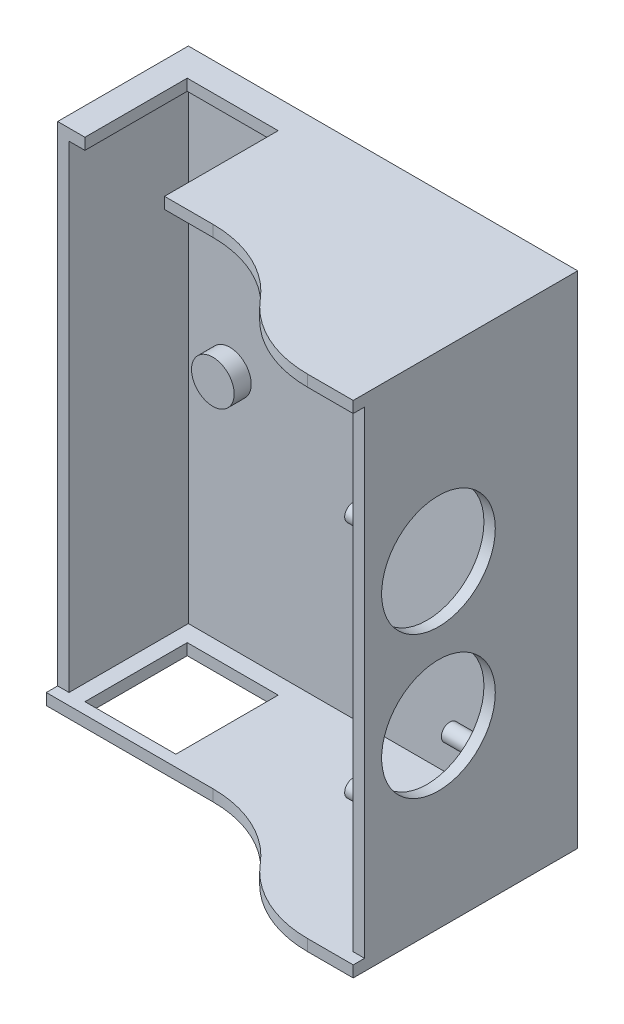
ISO-10303-21;
HEADER;
FILE_DESCRIPTION(('STEP AP214'),'2;1');
FILE_NAME('part.step','',(''),(''),'','','');
FILE_SCHEMA(('AUTOMOTIVE_DESIGN { 1 0 10303 214 1 1 1 1 }'));
ENDSEC;
DATA;
#1=APPLICATION_CONTEXT('core data for automotive mechanical design processes');
#2=APPLICATION_PROTOCOL_DEFINITION('international standard','automotive_design',2000,#1);
#3=PRODUCT_CONTEXT('',#1,'mechanical');
#4=PRODUCT('Part','Part','',(#3));
#5=PRODUCT_RELATED_PRODUCT_CATEGORY('part','',(#4));
#6=PRODUCT_DEFINITION_FORMATION('','',#4);
#7=PRODUCT_DEFINITION_CONTEXT('part definition',#1,'design');
#8=PRODUCT_DEFINITION('design','',#6,#7);
#9=PRODUCT_DEFINITION_SHAPE('','',#8);
#10=(LENGTH_UNIT() NAMED_UNIT(*) SI_UNIT(.MILLI.,.METRE.));
#11=(NAMED_UNIT(*) PLANE_ANGLE_UNIT() SI_UNIT($,.RADIAN.));
#12=(NAMED_UNIT(*) SI_UNIT($,.STERADIAN.) SOLID_ANGLE_UNIT());
#13=UNCERTAINTY_MEASURE_WITH_UNIT(LENGTH_MEASURE(1.E-05),#10,'distance_accuracy_value','');
#14=(GEOMETRIC_REPRESENTATION_CONTEXT(3) GLOBAL_UNCERTAINTY_ASSIGNED_CONTEXT((#13)) GLOBAL_UNIT_ASSIGNED_CONTEXT((#10,
#11,#12)) REPRESENTATION_CONTEXT('',''));
#15=CARTESIAN_POINT('',(0.,0.,0.));
#16=DIRECTION('',(0.,0.,1.));
#17=DIRECTION('',(1.,0.,0.));
#18=AXIS2_PLACEMENT_3D('',#15,#16,#17);
#19=CARTESIAN_POINT('',(-5.,83.,20.));
#20=DIRECTION('',(0.,0.,-1.));
#21=DIRECTION('',(-1.,0.,0.));
#22=AXIS2_PLACEMENT_3D('',#19,#20,#21);
#23=PLANE('',#22);
#24=DIRECTION('',(1.,0.,0.));
#25=VECTOR('',#24,1.);
#26=CARTESIAN_POINT('',(-5.,83.,20.));
#27=LINE('',#26,#25);
#28=CARTESIAN_POINT('',(15.8,83.,20.));
#29=VERTEX_POINT('',#28);
#30=CARTESIAN_POINT('',(24.3,83.,20.));
#31=VERTEX_POINT('',#30);
#32=EDGE_CURVE('E206',#29,#31,#27,.T.);
#33=ORIENTED_EDGE('',*,*,#32,.F.);
#34=DIRECTION('',(0.,1.,0.));
#35=VECTOR('',#34,1.);
#36=CARTESIAN_POINT('',(15.8,60.1040673814256,20.));
#37=LINE('',#36,#35);
#38=CARTESIAN_POINT('',(15.8,81.,20.));
#39=VERTEX_POINT('',#38);
#40=EDGE_CURVE('E213',#39,#29,#37,.T.);
#41=ORIENTED_EDGE('',*,*,#40,.F.);
#42=DIRECTION('',(1.,0.,0.));
#43=VECTOR('',#42,1.);
#44=CARTESIAN_POINT('',(-3.,81.,20.));
#45=LINE('',#44,#43);
#46=CARTESIAN_POINT('',(24.3,81.,20.));
#47=VERTEX_POINT('',#46);
#48=EDGE_CURVE('E311',#39,#47,#45,.T.);
#49=ORIENTED_EDGE('',*,*,#48,.T.);
#50=DIRECTION('',(0.,-1.,0.));
#51=VECTOR('',#50,1.);
#52=CARTESIAN_POINT('',(24.3,83.,20.));
#53=LINE('',#52,#51);
#54=EDGE_CURVE('E222',#31,#47,#53,.T.);
#55=ORIENTED_EDGE('',*,*,#54,.F.);
#56=EDGE_LOOP('',(#33,#41,#49,#55));
#57=FACE_BOUND('',#56,.T.);
#58=ADVANCED_FACE('F35',(#57),#23,.F.);
#59=CARTESIAN_POINT('',(0.,0.,34.5));
#60=DIRECTION('',(0.,0.,1.));
#61=DIRECTION('',(1.,0.,0.));
#62=AXIS2_PLACEMENT_3D('',#59,#60,#61);
#63=PLANE('',#62);
#64=DIRECTION('',(0.,1.,0.));
#65=VECTOR('',#64,1.);
#66=CARTESIAN_POINT('',(63.5,83.,34.5));
#67=LINE('',#66,#65);
#68=CARTESIAN_POINT('',(63.5,-5.,34.5));
#69=VERTEX_POINT('',#68);
#70=CARTESIAN_POINT('',(63.5,-2.99999999999999,34.5));
#71=VERTEX_POINT('',#70);
#72=EDGE_CURVE('E281',#69,#71,#67,.T.);
#73=ORIENTED_EDGE('',*,*,#72,.T.);
#74=DIRECTION('',(1.,0.,0.));
#75=VECTOR('',#74,1.);
#76=CARTESIAN_POINT('',(61.5,-2.99999999999999,34.5));
#77=LINE('',#76,#75);
#78=CARTESIAN_POINT('',(55.5,-2.99999999999999,34.5));
#79=VERTEX_POINT('',#78);
#80=EDGE_CURVE('E307',#79,#71,#77,.T.);
#81=ORIENTED_EDGE('',*,*,#80,.F.);
#82=DIRECTION('',(0.,-1.,0.));
#83=VECTOR('',#82,1.);
#84=CARTESIAN_POINT('',(55.5,83.,34.5));
#85=LINE('',#84,#83);
#86=CARTESIAN_POINT('',(55.5,-5.,34.5));
#87=VERTEX_POINT('',#86);
#88=EDGE_CURVE('E309',#87,#79,#85,.F.);
#89=ORIENTED_EDGE('',*,*,#88,.F.);
#90=DIRECTION('',(1.,0.,0.));
#91=VECTOR('',#90,1.);
#92=CARTESIAN_POINT('',(63.5,-5.,34.5));
#93=LINE('',#92,#91);
#94=EDGE_CURVE('E284',#87,#69,#93,.T.);
#95=ORIENTED_EDGE('',*,*,#94,.T.);
#96=EDGE_LOOP('',(#73,#81,#89,#95));
#97=FACE_BOUND('',#96,.T.);
#98=ADVANCED_FACE('F379',(#97),#63,.T.);
#99=CARTESIAN_POINT('',(0.,0.,-3.));
#100=DIRECTION('',(0.,0.,-1.));
#101=DIRECTION('',(-1.,0.,0.));
#102=AXIS2_PLACEMENT_3D('',#99,#100,#101);
#103=PLANE('',#102);
#104=DIRECTION('',(1.,0.,0.));
#105=VECTOR('',#104,1.);
#106=CARTESIAN_POINT('',(61.5,-2.99999999999999,-3.));
#107=LINE('',#106,#105);
#108=CARTESIAN_POINT('',(-3.,-3.,-3.));
#109=VERTEX_POINT('',#108);
#110=CARTESIAN_POINT('',(61.5,-2.99999999999999,-3.));
#111=VERTEX_POINT('',#110);
#112=EDGE_CURVE('E296',#109,#111,#107,.T.);
#113=ORIENTED_EDGE('',*,*,#112,.T.);
#114=DIRECTION('',(0.,1.,0.));
#115=VECTOR('',#114,1.);
#116=CARTESIAN_POINT('',(61.5,81.,-3.));
#117=LINE('',#116,#115);
#118=CARTESIAN_POINT('',(61.5,81.,-3.));
#119=VERTEX_POINT('',#118);
#120=EDGE_CURVE('E287',#111,#119,#117,.T.);
#121=ORIENTED_EDGE('',*,*,#120,.T.);
#122=DIRECTION('',(-1.,0.,0.));
#123=VECTOR('',#122,1.);
#124=CARTESIAN_POINT('',(-3.,81.,-3.));
#125=LINE('',#124,#123);
#126=CARTESIAN_POINT('',(-3.,81.,-3.));
#127=VERTEX_POINT('',#126);
#128=EDGE_CURVE('E290',#119,#127,#125,.T.);
#129=ORIENTED_EDGE('',*,*,#128,.T.);
#130=DIRECTION('',(0.,-1.,0.));
#131=VECTOR('',#130,1.);
#132=CARTESIAN_POINT('',(-3.,-3.,-3.));
#133=LINE('',#132,#131);
#134=EDGE_CURVE('E293',#127,#109,#133,.T.);
#135=ORIENTED_EDGE('',*,*,#134,.T.);
#136=EDGE_LOOP('',(#113,#121,#129,#135));
#137=FACE_BOUND('',#136,.T.);
#138=CARTESIAN_POINT('',(4.30000000000001,39.,-3.));
#139=DIRECTION('',(0.,0.,-1.));
#140=DIRECTION('',(-1.,0.,0.));
#141=AXIS2_PLACEMENT_3D('',#138,#139,#140);
#142=CIRCLE('',#141,3.75);
#143=CARTESIAN_POINT('',(0.550000000000002,39.,-3.));
#144=VERTEX_POINT('',#143);
#145=EDGE_CURVE('E43',#144,#144,#142,.F.);
#146=ORIENTED_EDGE('',*,*,#145,.F.);
#147=EDGE_LOOP('',(#146));
#148=FACE_BOUND('',#147,.T.);
#149=CARTESIAN_POINT('',(52.7,4.3,-3.));
#150=DIRECTION('',(0.,0.,-1.));
#151=DIRECTION('',(-1.,0.,0.));
#152=AXIS2_PLACEMENT_3D('',#149,#150,#151);
#153=CIRCLE('',#152,3.75000000000001);
#154=CARTESIAN_POINT('',(48.95,4.3,-3.));
#155=VERTEX_POINT('',#154);
#156=EDGE_CURVE('E366',#155,#155,#153,.T.);
#157=ORIENTED_EDGE('',*,*,#156,.T.);
#158=EDGE_LOOP('',(#157));
#159=FACE_BOUND('',#158,.T.);
#160=CARTESIAN_POINT('',(52.7,73.7,-3.));
#161=DIRECTION('',(0.,0.,-1.));
#162=DIRECTION('',(-1.,0.,0.));
#163=AXIS2_PLACEMENT_3D('',#160,#161,#162);
#164=CIRCLE('',#163,3.75000000000001);
#165=CARTESIAN_POINT('',(48.95,73.7,-3.));
#166=VERTEX_POINT('',#165);
#167=EDGE_CURVE('E12',#166,#166,#164,.F.);
#168=ORIENTED_EDGE('',*,*,#167,.F.);
#169=EDGE_LOOP('',(#168));
#170=FACE_BOUND('',#169,.T.);
#171=ADVANCED_FACE('F376',(#137,#148,#159,#170),#103,.F.);
#172=CARTESIAN_POINT('',(52.7,4.3,-3.));
#173=DIRECTION('',(0.,0.,1.));
#174=DIRECTION('',(1.,0.,0.));
#175=AXIS2_PLACEMENT_3D('',#172,#173,#174);
#176=CYLINDRICAL_SURFACE('',#175,3.75000000000001);
#177=ORIENTED_EDGE('',*,*,#156,.F.);
#178=EDGE_LOOP('',(#177));
#179=FACE_BOUND('',#178,.T.);
#180=CARTESIAN_POINT('',(52.7,4.3,0.));
#181=DIRECTION('',(0.,0.,-1.));
#182=DIRECTION('',(-1.,0.,0.));
#183=AXIS2_PLACEMENT_3D('',#180,#181,#182);
#184=CIRCLE('',#183,3.75000000000001);
#185=CARTESIAN_POINT('',(48.95,4.3,0.));
#186=VERTEX_POINT('',#185);
#187=EDGE_CURVE('E365',#186,#186,#184,.T.);
#188=ORIENTED_EDGE('',*,*,#187,.T.);
#189=EDGE_LOOP('',(#188));
#190=FACE_BOUND('',#189,.T.);
#191=ADVANCED_FACE('F37',(#179,#190),#176,.T.);
#192=CARTESIAN_POINT('',(52.7,4.3,0.));
#193=DIRECTION('',(0.,0.,-1.));
#194=DIRECTION('',(-1.,0.,0.));
#195=AXIS2_PLACEMENT_3D('',#192,#193,#194);
#196=PLANE('',#195);
#197=ORIENTED_EDGE('',*,*,#187,.F.);
#198=EDGE_LOOP('',(#197));
#199=FACE_BOUND('',#198,.T.);
#200=ADVANCED_FACE('F617',(#199),#196,.F.);
#201=CARTESIAN_POINT('',(4.30000000000001,39.,-3.));
#202=DIRECTION('',(0.,0.,1.));
#203=DIRECTION('',(1.,0.,0.));
#204=AXIS2_PLACEMENT_3D('',#201,#202,#203);
#205=CYLINDRICAL_SURFACE('',#204,3.75);
#206=ORIENTED_EDGE('',*,*,#145,.T.);
#207=EDGE_LOOP('',(#206));
#208=FACE_BOUND('',#207,.T.);
#209=CARTESIAN_POINT('',(4.30000000000001,39.,0.));
#210=DIRECTION('',(0.,0.,-1.));
#211=DIRECTION('',(-1.,0.,0.));
#212=AXIS2_PLACEMENT_3D('',#209,#210,#211);
#213=CIRCLE('',#212,3.75);
#214=CARTESIAN_POINT('',(0.550000000000002,39.,0.));
#215=VERTEX_POINT('',#214);
#216=EDGE_CURVE('E342',#215,#215,#213,.T.);
#217=ORIENTED_EDGE('',*,*,#216,.T.);
#218=EDGE_LOOP('',(#217));
#219=FACE_BOUND('',#218,.T.);
#220=ADVANCED_FACE('F373',(#208,#219),#205,.T.);
#221=CARTESIAN_POINT('',(4.30000000000001,39.,0.));
#222=DIRECTION('',(0.,0.,-1.));
#223=DIRECTION('',(-1.,0.,0.));
#224=AXIS2_PLACEMENT_3D('',#221,#222,#223);
#225=PLANE('',#224);
#226=ORIENTED_EDGE('',*,*,#216,.F.);
#227=EDGE_LOOP('',(#226));
#228=FACE_BOUND('',#227,.T.);
#229=ADVANCED_FACE('F390',(#228),#225,.F.);
#230=CARTESIAN_POINT('',(52.7,73.7,-3.));
#231=DIRECTION('',(0.,0.,1.));
#232=DIRECTION('',(1.,0.,0.));
#233=AXIS2_PLACEMENT_3D('',#230,#231,#232);
#234=CYLINDRICAL_SURFACE('',#233,3.75000000000001);
#235=ORIENTED_EDGE('',*,*,#167,.T.);
#236=EDGE_LOOP('',(#235));
#237=FACE_BOUND('',#236,.T.);
#238=CARTESIAN_POINT('',(52.7,73.7,0.));
#239=DIRECTION('',(0.,0.,-1.));
#240=DIRECTION('',(-1.,0.,0.));
#241=AXIS2_PLACEMENT_3D('',#238,#239,#240);
#242=CIRCLE('',#241,3.75000000000001);
#243=CARTESIAN_POINT('',(48.95,73.7,0.));
#244=VERTEX_POINT('',#243);
#245=EDGE_CURVE('E339',#244,#244,#242,.T.);
#246=ORIENTED_EDGE('',*,*,#245,.T.);
#247=EDGE_LOOP('',(#246));
#248=FACE_BOUND('',#247,.T.);
#249=ADVANCED_FACE('F386',(#237,#248),#234,.T.);
#250=CARTESIAN_POINT('',(52.7,73.7,0.));
#251=DIRECTION('',(0.,0.,-1.));
#252=DIRECTION('',(-1.,0.,0.));
#253=AXIS2_PLACEMENT_3D('',#250,#251,#252);
#254=PLANE('',#253);
#255=ORIENTED_EDGE('',*,*,#245,.F.);
#256=EDGE_LOOP('',(#255));
#257=FACE_BOUND('',#256,.T.);
#258=ADVANCED_FACE('F389',(#257),#254,.F.);
#259=CARTESIAN_POINT('',(52.7573593128807,59.5,28.));
#260=DIRECTION('',(1.,0.,0.));
#261=DIRECTION('',(0.,1.,0.));
#262=AXIS2_PLACEMENT_3D('',#259,#260,#261);
#263=CYLINDRICAL_SURFACE('',#262,1.5);
#264=CARTESIAN_POINT('',(61.5,59.5,28.));
#265=DIRECTION('',(-1.,0.,0.));
#266=DIRECTION('',(0.,-1.,0.));
#267=AXIS2_PLACEMENT_3D('',#264,#265,#266);
#268=CIRCLE('',#267,1.5);
#269=CARTESIAN_POINT('',(61.5,58.,28.));
#270=VERTEX_POINT('',#269);
#271=EDGE_CURVE('E333',#270,#270,#268,.T.);
#272=ORIENTED_EDGE('',*,*,#271,.T.);
#273=EDGE_LOOP('',(#272));
#274=FACE_BOUND('',#273,.T.);
#275=CARTESIAN_POINT('',(57.,59.5,28.));
#276=DIRECTION('',(-1.,0.,0.));
#277=DIRECTION('',(0.,0.,1.));
#278=AXIS2_PLACEMENT_3D('',#275,#276,#277);
#279=CIRCLE('',#278,1.5);
#280=CARTESIAN_POINT('',(57.,59.5,29.5));
#281=VERTEX_POINT('',#280);
#282=EDGE_CURVE('E336',#281,#281,#279,.T.);
#283=ORIENTED_EDGE('',*,*,#282,.F.);
#284=EDGE_LOOP('',(#283));
#285=FACE_BOUND('',#284,.T.);
#286=ADVANCED_FACE('F395',(#274,#285),#263,.T.);
#287=CARTESIAN_POINT('',(57.,0.,1.5));
#288=DIRECTION('',(-1.,0.,0.));
#289=DIRECTION('',(0.,0.,1.));
#290=AXIS2_PLACEMENT_3D('',#287,#288,#289);
#291=PLANE('',#290);
#292=ORIENTED_EDGE('',*,*,#282,.T.);
#293=EDGE_LOOP('',(#292));
#294=FACE_BOUND('',#293,.T.);
#295=ADVANCED_FACE('F400',(#294),#291,.T.);
#296=CARTESIAN_POINT('',(61.5,81.,151.017935777165));
#297=DIRECTION('',(-1.,0.,0.));
#298=DIRECTION('',(0.,-1.,0.));
#299=AXIS2_PLACEMENT_3D('',#296,#297,#298);
#300=PLANE('',#299);
#301=DIRECTION('',(0.,1.,0.));
#302=VECTOR('',#301,1.);
#303=CARTESIAN_POINT('',(61.5,-2.99999999999998,32.5));
#304=LINE('',#303,#302);
#305=CARTESIAN_POINT('',(61.5,-2.99999999999999,32.5));
#306=VERTEX_POINT('',#305);
#307=CARTESIAN_POINT('',(61.5,81.,32.5));
#308=VERTEX_POINT('',#307);
#309=EDGE_CURVE('E482',#306,#308,#304,.T.);
#310=ORIENTED_EDGE('',*,*,#309,.T.);
#311=DIRECTION('',(0.,0.,-1.));
#312=VECTOR('',#311,1.);
#313=CARTESIAN_POINT('',(61.5,81.,151.017935777165));
#314=LINE('',#313,#312);
#315=EDGE_CURVE('E305',#308,#119,#314,.T.);
#316=ORIENTED_EDGE('',*,*,#315,.T.);
#317=ORIENTED_EDGE('',*,*,#120,.F.);
#318=DIRECTION('',(0.,0.,-1.));
#319=VECTOR('',#318,1.);
#320=CARTESIAN_POINT('',(61.5,-2.99999999999999,151.017935777165));
#321=LINE('',#320,#319);
#322=EDGE_CURVE('E299',#306,#111,#321,.T.);
#323=ORIENTED_EDGE('',*,*,#322,.F.);
#324=EDGE_LOOP('',(#310,#316,#317,#323));
#325=FACE_BOUND('',#324,.T.);
#326=CARTESIAN_POINT('',(61.5,59.5,11.));
#327=DIRECTION('',(-1.,0.,0.));
#328=DIRECTION('',(0.,-1.,0.));
#329=AXIS2_PLACEMENT_3D('',#326,#327,#328);
#330=CIRCLE('',#329,1.5);
#331=CARTESIAN_POINT('',(61.5,58.,11.));
#332=VERTEX_POINT('',#331);
#333=EDGE_CURVE('E327',#332,#332,#330,.T.);
#334=ORIENTED_EDGE('',*,*,#333,.F.);
#335=EDGE_LOOP('',(#334));
#336=FACE_BOUND('',#335,.T.);
#337=CARTESIAN_POINT('',(61.5,17.5,11.));
#338=DIRECTION('',(-1.,0.,0.));
#339=DIRECTION('',(0.,-1.,0.));
#340=AXIS2_PLACEMENT_3D('',#337,#338,#339);
#341=CIRCLE('',#340,1.5);
#342=CARTESIAN_POINT('',(61.5,16.,11.));
#343=VERTEX_POINT('',#342);
#344=EDGE_CURVE('E315',#343,#343,#341,.T.);
#345=ORIENTED_EDGE('',*,*,#344,.F.);
#346=EDGE_LOOP('',(#345));
#347=FACE_BOUND('',#346,.T.);
#348=CARTESIAN_POINT('',(61.5,26.,19.5));
#349=DIRECTION('',(-1.,0.,0.));
#350=DIRECTION('',(0.,-1.,0.));
#351=AXIS2_PLACEMENT_3D('',#348,#349,#350);
#352=CIRCLE('',#351,10.);
#353=CARTESIAN_POINT('',(61.5,16.,19.5));
#354=VERTEX_POINT('',#353);
#355=EDGE_CURVE('E265',#354,#354,#352,.F.);
#356=ORIENTED_EDGE('',*,*,#355,.T.);
#357=EDGE_LOOP('',(#356));
#358=FACE_BOUND('',#357,.T.);
#359=CARTESIAN_POINT('',(61.5,51.,19.5));
#360=DIRECTION('',(-1.,0.,0.));
#361=DIRECTION('',(0.,-1.,0.));
#362=AXIS2_PLACEMENT_3D('',#359,#360,#361);
#363=CIRCLE('',#362,10.);
#364=CARTESIAN_POINT('',(61.5,41.,19.5));
#365=VERTEX_POINT('',#364);
#366=EDGE_CURVE('E271',#365,#365,#363,.F.);
#367=ORIENTED_EDGE('',*,*,#366,.T.);
#368=EDGE_LOOP('',(#367));
#369=FACE_BOUND('',#368,.T.);
#370=CARTESIAN_POINT('',(61.5,17.5,28.));
#371=DIRECTION('',(-1.,0.,0.));
#372=DIRECTION('',(0.,-1.,0.));
#373=AXIS2_PLACEMENT_3D('',#370,#371,#372);
#374=CIRCLE('',#373,1.5);
#375=CARTESIAN_POINT('',(61.5,16.,28.));
#376=VERTEX_POINT('',#375);
#377=EDGE_CURVE('E321',#376,#376,#374,.T.);
#378=ORIENTED_EDGE('',*,*,#377,.F.);
#379=EDGE_LOOP('',(#378));
#380=FACE_BOUND('',#379,.T.);
#381=ORIENTED_EDGE('',*,*,#271,.F.);
#382=EDGE_LOOP('',(#381));
#383=FACE_BOUND('',#382,.T.);
#384=ADVANCED_FACE('F487',(#325,#336,#347,#358,#369,#380,#383),#300,.T.);
#385=CARTESIAN_POINT('',(52.7573593128807,59.5,11.));
#386=DIRECTION('',(1.,0.,0.));
#387=DIRECTION('',(0.,1.,0.));
#388=AXIS2_PLACEMENT_3D('',#385,#386,#387);
#389=CYLINDRICAL_SURFACE('',#388,1.5);
#390=ORIENTED_EDGE('',*,*,#333,.T.);
#391=EDGE_LOOP('',(#390));
#392=FACE_BOUND('',#391,.T.);
#393=CARTESIAN_POINT('',(57.,59.5,11.));
#394=DIRECTION('',(-1.,0.,0.));
#395=DIRECTION('',(0.,0.,1.));
#396=AXIS2_PLACEMENT_3D('',#393,#394,#395);
#397=CIRCLE('',#396,1.5);
#398=CARTESIAN_POINT('',(57.,59.5,12.5));
#399=VERTEX_POINT('',#398);
#400=EDGE_CURVE('E330',#399,#399,#397,.T.);
#401=ORIENTED_EDGE('',*,*,#400,.F.);
#402=EDGE_LOOP('',(#401));
#403=FACE_BOUND('',#402,.T.);
#404=ADVANCED_FACE('F823',(#392,#403),#389,.T.);
#405=CARTESIAN_POINT('',(57.,0.,1.5));
#406=DIRECTION('',(-1.,0.,0.));
#407=DIRECTION('',(0.,0.,1.));
#408=AXIS2_PLACEMENT_3D('',#405,#406,#407);
#409=PLANE('',#408);
#410=ORIENTED_EDGE('',*,*,#400,.T.);
#411=EDGE_LOOP('',(#410));
#412=FACE_BOUND('',#411,.T.);
#413=ADVANCED_FACE('F878',(#412),#409,.T.);
#414=CARTESIAN_POINT('',(52.7573593128807,17.5,28.));
#415=DIRECTION('',(1.,0.,0.));
#416=DIRECTION('',(0.,1.,0.));
#417=AXIS2_PLACEMENT_3D('',#414,#415,#416);
#418=CYLINDRICAL_SURFACE('',#417,1.5);
#419=ORIENTED_EDGE('',*,*,#377,.T.);
#420=EDGE_LOOP('',(#419));
#421=FACE_BOUND('',#420,.T.);
#422=CARTESIAN_POINT('',(57.,17.5,28.));
#423=DIRECTION('',(-1.,0.,0.));
#424=DIRECTION('',(0.,0.,1.));
#425=AXIS2_PLACEMENT_3D('',#422,#423,#424);
#426=CIRCLE('',#425,1.5);
#427=CARTESIAN_POINT('',(57.,17.5,29.5));
#428=VERTEX_POINT('',#427);
#429=EDGE_CURVE('E324',#428,#428,#426,.T.);
#430=ORIENTED_EDGE('',*,*,#429,.F.);
#431=EDGE_LOOP('',(#430));
#432=FACE_BOUND('',#431,.T.);
#433=ADVANCED_FACE('F869',(#421,#432),#418,.T.);
#434=CARTESIAN_POINT('',(57.,0.,1.5));
#435=DIRECTION('',(-1.,0.,0.));
#436=DIRECTION('',(0.,0.,1.));
#437=AXIS2_PLACEMENT_3D('',#434,#435,#436);
#438=PLANE('',#437);
#439=ORIENTED_EDGE('',*,*,#429,.T.);
#440=EDGE_LOOP('',(#439));
#441=FACE_BOUND('',#440,.T.);
#442=ADVANCED_FACE('F860',(#441),#438,.T.);
#443=CARTESIAN_POINT('',(52.7573593128807,17.5,11.));
#444=DIRECTION('',(1.,0.,0.));
#445=DIRECTION('',(0.,1.,0.));
#446=AXIS2_PLACEMENT_3D('',#443,#444,#445);
#447=CYLINDRICAL_SURFACE('',#446,1.5);
#448=ORIENTED_EDGE('',*,*,#344,.T.);
#449=EDGE_LOOP('',(#448));
#450=FACE_BOUND('',#449,.T.);
#451=CARTESIAN_POINT('',(57.,17.5,11.));
#452=DIRECTION('',(-1.,0.,0.));
#453=DIRECTION('',(0.,0.,1.));
#454=AXIS2_PLACEMENT_3D('',#451,#452,#453);
#455=CIRCLE('',#454,1.5);
#456=CARTESIAN_POINT('',(57.,17.5,12.5));
#457=VERTEX_POINT('',#456);
#458=EDGE_CURVE('E318',#457,#457,#455,.T.);
#459=ORIENTED_EDGE('',*,*,#458,.F.);
#460=EDGE_LOOP('',(#459));
#461=FACE_BOUND('',#460,.T.);
#462=ADVANCED_FACE('F851',(#450,#461),#447,.T.);
#463=CARTESIAN_POINT('',(57.,0.,1.5));
#464=DIRECTION('',(-1.,0.,0.));
#465=DIRECTION('',(0.,0.,1.));
#466=AXIS2_PLACEMENT_3D('',#463,#464,#465);
#467=PLANE('',#466);
#468=ORIENTED_EDGE('',*,*,#458,.T.);
#469=EDGE_LOOP('',(#468));
#470=FACE_BOUND('',#469,.T.);
#471=ADVANCED_FACE('F804',(#470),#467,.T.);
#472=CARTESIAN_POINT('',(61.5,-2.99999999999999,151.017935777165));
#473=DIRECTION('',(0.,1.,0.));
#474=DIRECTION('',(-1.,0.,0.));
#475=AXIS2_PLACEMENT_3D('',#472,#473,#474);
#476=PLANE('',#475);
#477=DIRECTION('',(-1.,0.,0.));
#478=VECTOR('',#477,1.);
#479=CARTESIAN_POINT('',(61.5,-2.99999999999999,0.));
#480=LINE('',#479,#478);
#481=CARTESIAN_POINT('',(15.8,-3.,0.));
#482=VERTEX_POINT('',#481);
#483=CARTESIAN_POINT('',(-0.2,-3.,0.));
#484=VERTEX_POINT('',#483);
#485=EDGE_CURVE('E502',#482,#484,#480,.T.);
#486=ORIENTED_EDGE('',*,*,#485,.F.);
#487=DIRECTION('',(0.,0.,-1.));
#488=VECTOR('',#487,1.);
#489=CARTESIAN_POINT('',(15.8,-3.,151.017935777165));
#490=LINE('',#489,#488);
#491=CARTESIAN_POINT('',(15.8,-3.,18.));
#492=VERTEX_POINT('',#491);
#493=EDGE_CURVE('E513',#492,#482,#490,.T.);
#494=ORIENTED_EDGE('',*,*,#493,.F.);
#495=DIRECTION('',(1.,0.,0.));
#496=VECTOR('',#495,1.);
#497=CARTESIAN_POINT('',(61.5,-2.99999999999999,18.));
#498=LINE('',#497,#496);
#499=CARTESIAN_POINT('',(-0.2,-3.,18.));
#500=VERTEX_POINT('',#499);
#501=EDGE_CURVE('E511',#500,#492,#498,.T.);
#502=ORIENTED_EDGE('',*,*,#501,.F.);
#503=DIRECTION('',(0.,0.,1.));
#504=VECTOR('',#503,1.);
#505=CARTESIAN_POINT('',(-0.199999999999999,-3.,151.017935777165));
#506=LINE('',#505,#504);
#507=EDGE_CURVE('E507',#484,#500,#506,.T.);
#508=ORIENTED_EDGE('',*,*,#507,.F.);
#509=EDGE_LOOP('',(#486,#494,#502,#508));
#510=FACE_BOUND('',#509,.T.);
#511=CARTESIAN_POINT('',(55.5,-2.99999999999999,14.0915517241379));
#512=DIRECTION('',(0.,1.,0.));
#513=DIRECTION('',(-1.,0.,0.));
#514=AXIS2_PLACEMENT_3D('',#511,#512,#513);
#515=CIRCLE('',#514,20.4084482758621);
#516=CARTESIAN_POINT('',(39.9,-3.,27.25));
#517=VERTEX_POINT('',#516);
#518=EDGE_CURVE('E256',#79,#517,#515,.F.);
#519=ORIENTED_EDGE('',*,*,#518,.F.);
#520=ORIENTED_EDGE('',*,*,#80,.T.);
#521=DIRECTION('',(0.,0.,-1.));
#522=VECTOR('',#521,1.);
#523=CARTESIAN_POINT('',(63.5,-2.99999999999999,32.5));
#524=LINE('',#523,#522);
#525=CARTESIAN_POINT('',(63.5,-2.99999999999999,32.5));
#526=VERTEX_POINT('',#525);
#527=EDGE_CURVE('E468',#71,#526,#524,.T.);
#528=ORIENTED_EDGE('',*,*,#527,.T.);
#529=DIRECTION('',(1.,0.,0.));
#530=VECTOR('',#529,1.);
#531=CARTESIAN_POINT('',(-5.00100000000001,-2.99999999999999,32.5));
#532=LINE('',#531,#530);
#533=EDGE_CURVE('E241',#306,#526,#532,.T.);
#534=ORIENTED_EDGE('',*,*,#533,.F.);
#535=ORIENTED_EDGE('',*,*,#322,.T.);
#536=ORIENTED_EDGE('',*,*,#112,.F.);
#537=DIRECTION('',(0.,0.,-1.));
#538=VECTOR('',#537,1.);
#539=CARTESIAN_POINT('',(-3.,-3.,151.017935777165));
#540=LINE('',#539,#538);
#541=CARTESIAN_POINT('',(-3.,-3.,18.));
#542=VERTEX_POINT('',#541);
#543=EDGE_CURVE('E301',#542,#109,#540,.T.);
#544=ORIENTED_EDGE('',*,*,#543,.F.);
#545=DIRECTION('',(-1.,0.,0.));
#546=VECTOR('',#545,1.);
#547=CARTESIAN_POINT('',(81.0238061504,-3.,18.));
#548=LINE('',#547,#546);
#549=CARTESIAN_POINT('',(-5.,-3.,18.));
#550=VERTEX_POINT('',#549);
#551=EDGE_CURVE('E440',#542,#550,#548,.T.);
#552=ORIENTED_EDGE('',*,*,#551,.T.);
#553=DIRECTION('',(0.,0.,1.));
#554=VECTOR('',#553,1.);
#555=CARTESIAN_POINT('',(-5.,-3.,20.));
#556=LINE('',#555,#554);
#557=CARTESIAN_POINT('',(-5.,-3.,20.));
#558=VERTEX_POINT('',#557);
#559=EDGE_CURVE('E436',#550,#558,#556,.T.);
#560=ORIENTED_EDGE('',*,*,#559,.T.);
#561=DIRECTION('',(-1.,0.,0.));
#562=VECTOR('',#561,1.);
#563=CARTESIAN_POINT('',(61.5,-2.99999999999999,20.));
#564=LINE('',#563,#562);
#565=CARTESIAN_POINT('',(24.3,-3.,20.));
#566=VERTEX_POINT('',#565);
#567=EDGE_CURVE('E258',#566,#558,#564,.T.);
#568=ORIENTED_EDGE('',*,*,#567,.F.);
#569=CARTESIAN_POINT('',(24.3,-3.,40.408448275862));
#570=DIRECTION('',(0.,1.,0.));
#571=DIRECTION('',(-1.,0.,0.));
#572=AXIS2_PLACEMENT_3D('',#569,#570,#571);
#573=CIRCLE('',#572,20.408448275862);
#574=EDGE_CURVE('E260',#517,#566,#573,.T.);
#575=ORIENTED_EDGE('',*,*,#574,.F.);
#576=EDGE_LOOP('',(#519,#520,#528,#534,#535,#536,#544,#552,#560,#568,#575));
#577=FACE_BOUND('',#576,.T.);
#578=ADVANCED_FACE('F438',(#510,#577),#476,.T.);
#579=CARTESIAN_POINT('',(-3.,-3.,151.017935777165));
#580=DIRECTION('',(1.,0.,0.));
#581=DIRECTION('',(0.,0.,-1.));
#582=AXIS2_PLACEMENT_3D('',#579,#580,#581);
#583=PLANE('',#582);
#584=DIRECTION('',(0.,-1.,0.));
#585=VECTOR('',#584,1.);
#586=CARTESIAN_POINT('',(-3.,81.,18.));
#587=LINE('',#586,#585);
#588=CARTESIAN_POINT('',(-3.,81.,18.));
#589=VERTEX_POINT('',#588);
#590=EDGE_CURVE('E442',#589,#542,#587,.T.);
#591=ORIENTED_EDGE('',*,*,#590,.T.);
#592=ORIENTED_EDGE('',*,*,#543,.T.);
#593=ORIENTED_EDGE('',*,*,#134,.F.);
#594=DIRECTION('',(0.,0.,-1.));
#595=VECTOR('',#594,1.);
#596=CARTESIAN_POINT('',(-3.,81.,151.017935777165));
#597=LINE('',#596,#595);
#598=EDGE_CURVE('E303',#589,#127,#597,.T.);
#599=ORIENTED_EDGE('',*,*,#598,.F.);
#600=EDGE_LOOP('',(#591,#592,#593,#599));
#601=FACE_BOUND('',#600,.T.);
#602=ADVANCED_FACE('F494',(#601),#583,.T.);
#603=CARTESIAN_POINT('',(-3.,81.,151.017935777165));
#604=DIRECTION('',(0.,-1.,0.));
#605=DIRECTION('',(0.,0.,-1.));
#606=AXIS2_PLACEMENT_3D('',#603,#604,#605);
#607=PLANE('',#606);
#608=ORIENTED_EDGE('',*,*,#48,.F.);
#609=DIRECTION('',(0.,0.,1.));
#610=VECTOR('',#609,1.);
#611=CARTESIAN_POINT('',(15.8,81.,151.017935777165));
#612=LINE('',#611,#610);
#613=CARTESIAN_POINT('',(15.8,81.,0.));
#614=VERTEX_POINT('',#613);
#615=EDGE_CURVE('E210',#614,#39,#612,.T.);
#616=ORIENTED_EDGE('',*,*,#615,.F.);
#617=DIRECTION('',(1.,0.,0.));
#618=VECTOR('',#617,1.);
#619=CARTESIAN_POINT('',(-3.,81.,0.));
#620=LINE('',#619,#618);
#621=CARTESIAN_POINT('',(-0.2,81.,0.));
#622=VERTEX_POINT('',#621);
#623=EDGE_CURVE('E505',#622,#614,#620,.T.);
#624=ORIENTED_EDGE('',*,*,#623,.F.);
#625=DIRECTION('',(0.,0.,-1.));
#626=VECTOR('',#625,1.);
#627=CARTESIAN_POINT('',(-0.2,81.,151.017935777165));
#628=LINE('',#627,#626);
#629=CARTESIAN_POINT('',(-0.2,81.,18.));
#630=VERTEX_POINT('',#629);
#631=EDGE_CURVE('E509',#630,#622,#628,.T.);
#632=ORIENTED_EDGE('',*,*,#631,.F.);
#633=DIRECTION('',(-1.,0.,0.));
#634=VECTOR('',#633,1.);
#635=CARTESIAN_POINT('',(-5.,81.,18.));
#636=LINE('',#635,#634);
#637=EDGE_CURVE('E218',#630,#589,#636,.T.);
#638=ORIENTED_EDGE('',*,*,#637,.T.);
#639=ORIENTED_EDGE('',*,*,#598,.T.);
#640=ORIENTED_EDGE('',*,*,#128,.F.);
#641=ORIENTED_EDGE('',*,*,#315,.F.);
#642=DIRECTION('',(1.,0.,0.));
#643=VECTOR('',#642,1.);
#644=CARTESIAN_POINT('',(-5.00100000000001,81.,32.5));
#645=LINE('',#644,#643);
#646=CARTESIAN_POINT('',(63.5,81.,32.5));
#647=VERTEX_POINT('',#646);
#648=EDGE_CURVE('E232',#308,#647,#645,.T.);
#649=ORIENTED_EDGE('',*,*,#648,.T.);
#650=DIRECTION('',(0.,0.,1.));
#651=VECTOR('',#650,1.);
#652=CARTESIAN_POINT('',(63.5,81.,32.5));
#653=LINE('',#652,#651);
#654=CARTESIAN_POINT('',(63.5,81.,34.5));
#655=VERTEX_POINT('',#654);
#656=EDGE_CURVE('E474',#647,#655,#653,.T.);
#657=ORIENTED_EDGE('',*,*,#656,.T.);
#658=DIRECTION('',(-1.,0.,0.));
#659=VECTOR('',#658,1.);
#660=CARTESIAN_POINT('',(-3.,81.,34.5));
#661=LINE('',#660,#659);
#662=CARTESIAN_POINT('',(55.5,81.,34.5));
#663=VERTEX_POINT('',#662);
#664=EDGE_CURVE('E274',#655,#663,#661,.T.);
#665=ORIENTED_EDGE('',*,*,#664,.T.);
#666=CARTESIAN_POINT('',(55.5,81.,14.0915517241379));
#667=DIRECTION('',(0.,-1.,0.));
#668=DIRECTION('',(0.,0.,-1.));
#669=AXIS2_PLACEMENT_3D('',#666,#667,#668);
#670=CIRCLE('',#669,20.4084482758621);
#671=CARTESIAN_POINT('',(39.9,81.,27.25));
#672=VERTEX_POINT('',#671);
#673=EDGE_CURVE('E247',#672,#663,#670,.F.);
#674=ORIENTED_EDGE('',*,*,#673,.F.);
#675=CARTESIAN_POINT('',(24.3,81.,40.408448275862));
#676=DIRECTION('',(0.,-1.,0.));
#677=DIRECTION('',(0.,0.,-1.));
#678=AXIS2_PLACEMENT_3D('',#675,#676,#677);
#679=CIRCLE('',#678,20.408448275862);
#680=EDGE_CURVE('E313',#47,#672,#679,.T.);
#681=ORIENTED_EDGE('',*,*,#680,.F.);
#682=EDGE_LOOP('',(#608,#616,#624,#632,#638,#639,#640,#641,#649,#657,#665,#674,#681));
#683=FACE_BOUND('',#682,.T.);
#684=ADVANCED_FACE('F553',(#683),#607,.T.);
#685=ORIENTED_EDGE('',*,*,#664,.F.);
#686=CARTESIAN_POINT('',(63.5,83.,34.5));
#687=VERTEX_POINT('',#686);
#688=EDGE_CURVE('E280',#655,#687,#67,.T.);
#689=ORIENTED_EDGE('',*,*,#688,.T.);
#690=DIRECTION('',(-1.,0.,0.));
#691=VECTOR('',#690,1.);
#692=CARTESIAN_POINT('',(-5.,83.,34.5));
#693=LINE('',#692,#691);
#694=CARTESIAN_POINT('',(55.5,83.,34.5));
#695=VERTEX_POINT('',#694);
#696=EDGE_CURVE('E277',#687,#695,#693,.T.);
#697=ORIENTED_EDGE('',*,*,#696,.T.);
#698=DIRECTION('',(0.,-1.,0.));
#699=VECTOR('',#698,1.);
#700=CARTESIAN_POINT('',(55.5,83.,34.5));
#701=LINE('',#700,#699);
#702=EDGE_CURVE('E244',#695,#663,#701,.T.);
#703=ORIENTED_EDGE('',*,*,#702,.T.);
#704=EDGE_LOOP('',(#685,#689,#697,#703));
#705=FACE_BOUND('',#704,.T.);
#706=ADVANCED_FACE('F412',(#705),#63,.T.);
#707=CARTESIAN_POINT('',(33.215728752538,51.,19.5));
#708=DIRECTION('',(1.,0.,0.));
#709=DIRECTION('',(0.,0.,-1.));
#710=AXIS2_PLACEMENT_3D('',#707,#708,#709);
#711=CYLINDRICAL_SURFACE('',#710,10.);
#712=CARTESIAN_POINT('',(63.5,51.,19.5));
#713=DIRECTION('',(1.,0.,0.));
#714=DIRECTION('',(0.,0.,-1.));
#715=AXIS2_PLACEMENT_3D('',#712,#713,#714);
#716=CIRCLE('',#715,10.);
#717=CARTESIAN_POINT('',(63.5,51.,9.50000000000001));
#718=VERTEX_POINT('',#717);
#719=EDGE_CURVE('E268',#718,#718,#716,.T.);
#720=ORIENTED_EDGE('',*,*,#719,.T.);
#721=EDGE_LOOP('',(#720));
#722=FACE_BOUND('',#721,.T.);
#723=ORIENTED_EDGE('',*,*,#366,.F.);
#724=EDGE_LOOP('',(#723));
#725=FACE_BOUND('',#724,.T.);
#726=ADVANCED_FACE('F814',(#722,#725),#711,.F.);
#727=CARTESIAN_POINT('',(33.215728752538,26.,19.5));
#728=DIRECTION('',(1.,0.,0.));
#729=DIRECTION('',(0.,0.,-1.));
#730=AXIS2_PLACEMENT_3D('',#727,#728,#729);
#731=CYLINDRICAL_SURFACE('',#730,10.);
#732=CARTESIAN_POINT('',(63.5,26.,19.5));
#733=DIRECTION('',(1.,0.,0.));
#734=DIRECTION('',(0.,0.,-1.));
#735=AXIS2_PLACEMENT_3D('',#732,#733,#734);
#736=CIRCLE('',#735,10.);
#737=CARTESIAN_POINT('',(63.5,26.,9.5));
#738=VERTEX_POINT('',#737);
#739=EDGE_CURVE('E262',#738,#738,#736,.T.);
#740=ORIENTED_EDGE('',*,*,#739,.T.);
#741=EDGE_LOOP('',(#740));
#742=FACE_BOUND('',#741,.T.);
#743=ORIENTED_EDGE('',*,*,#355,.F.);
#744=EDGE_LOOP('',(#743));
#745=FACE_BOUND('',#744,.T.);
#746=ADVANCED_FACE('F831',(#742,#745),#731,.F.);
#747=CARTESIAN_POINT('',(24.3,83.,40.408448275862));
#748=DIRECTION('',(0.,-1.,0.));
#749=DIRECTION('',(0.,0.,-1.));
#750=AXIS2_PLACEMENT_3D('',#747,#748,#749);
#751=CYLINDRICAL_SURFACE('',#750,20.408448275862);
#752=ORIENTED_EDGE('',*,*,#574,.T.);
#753=CARTESIAN_POINT('',(24.3,-5.,20.));
#754=VERTEX_POINT('',#753);
#755=EDGE_CURVE('E253',#566,#754,#53,.T.);
#756=ORIENTED_EDGE('',*,*,#755,.T.);
#757=CARTESIAN_POINT('',(24.3,-5.,40.408448275862));
#758=DIRECTION('',(0.,-1.,0.));
#759=DIRECTION('',(0.,0.,-1.));
#760=AXIS2_PLACEMENT_3D('',#757,#758,#759);
#761=CIRCLE('',#760,20.408448275862);
#762=CARTESIAN_POINT('',(39.9,-5.,27.25));
#763=VERTEX_POINT('',#762);
#764=EDGE_CURVE('E229',#754,#763,#761,.T.);
#765=ORIENTED_EDGE('',*,*,#764,.T.);
#766=DIRECTION('',(0.,-1.,0.));
#767=VECTOR('',#766,1.);
#768=CARTESIAN_POINT('',(39.9,83.,27.25));
#769=LINE('',#768,#767);
#770=EDGE_CURVE('E251',#517,#763,#769,.T.);
#771=ORIENTED_EDGE('',*,*,#770,.F.);
#772=EDGE_LOOP('',(#752,#756,#765,#771));
#773=FACE_BOUND('',#772,.T.);
#774=ADVANCED_FACE('F427',(#773),#751,.F.);
#775=CARTESIAN_POINT('',(55.5,83.,14.0915517241379));
#776=DIRECTION('',(0.,-1.,0.));
#777=DIRECTION('',(0.,0.,-1.));
#778=AXIS2_PLACEMENT_3D('',#775,#776,#777);
#779=CYLINDRICAL_SURFACE('',#778,20.4084482758621);
#780=ORIENTED_EDGE('',*,*,#518,.T.);
#781=ORIENTED_EDGE('',*,*,#770,.T.);
#782=CARTESIAN_POINT('',(55.5,-5.,14.0915517241379));
#783=DIRECTION('',(0.,1.,0.));
#784=DIRECTION('',(0.,0.,1.));
#785=AXIS2_PLACEMENT_3D('',#782,#783,#784);
#786=CIRCLE('',#785,20.4084482758621);
#787=EDGE_CURVE('E225',#763,#87,#786,.T.);
#788=ORIENTED_EDGE('',*,*,#787,.T.);
#789=ORIENTED_EDGE('',*,*,#88,.T.);
#790=EDGE_LOOP('',(#780,#781,#788,#789));
#791=FACE_BOUND('',#790,.T.);
#792=ADVANCED_FACE('F564',(#791),#779,.T.);
#793=ORIENTED_EDGE('',*,*,#673,.T.);
#794=ORIENTED_EDGE('',*,*,#702,.F.);
#795=CARTESIAN_POINT('',(55.5,83.,14.0915517241379));
#796=DIRECTION('',(0.,1.,0.));
#797=DIRECTION('',(0.,0.,1.));
#798=AXIS2_PLACEMENT_3D('',#795,#796,#797);
#799=CIRCLE('',#798,20.4084482758621);
#800=CARTESIAN_POINT('',(39.9,83.,27.25));
#801=VERTEX_POINT('',#800);
#802=EDGE_CURVE('E227',#801,#695,#799,.T.);
#803=ORIENTED_EDGE('',*,*,#802,.F.);
#804=EDGE_CURVE('E248',#801,#672,#769,.T.);
#805=ORIENTED_EDGE('',*,*,#804,.T.);
#806=EDGE_LOOP('',(#793,#794,#803,#805));
#807=FACE_BOUND('',#806,.T.);
#808=ADVANCED_FACE('F425',(#807),#779,.T.);
#809=ORIENTED_EDGE('',*,*,#680,.T.);
#810=ORIENTED_EDGE('',*,*,#804,.F.);
#811=CARTESIAN_POINT('',(24.3,83.,40.408448275862));
#812=DIRECTION('',(0.,-1.,0.));
#813=DIRECTION('',(0.,0.,-1.));
#814=AXIS2_PLACEMENT_3D('',#811,#812,#813);
#815=CIRCLE('',#814,20.408448275862);
#816=EDGE_CURVE('E224',#31,#801,#815,.T.);
#817=ORIENTED_EDGE('',*,*,#816,.F.);
#818=ORIENTED_EDGE('',*,*,#54,.T.);
#819=EDGE_LOOP('',(#809,#810,#817,#818));
#820=FACE_BOUND('',#819,.T.);
#821=ADVANCED_FACE('F417',(#820),#751,.F.);
#822=ORIENTED_EDGE('',*,*,#567,.T.);
#823=DIRECTION('',(0.,-1.,0.));
#824=VECTOR('',#823,1.);
#825=CARTESIAN_POINT('',(-5.,83.,20.));
#826=LINE('',#825,#824);
#827=CARTESIAN_POINT('',(-5.,-5.,20.));
#828=VERTEX_POINT('',#827);
#829=EDGE_CURVE('E237',#558,#828,#826,.T.);
#830=ORIENTED_EDGE('',*,*,#829,.T.);
#831=DIRECTION('',(1.,0.,0.));
#832=VECTOR('',#831,1.);
#833=CARTESIAN_POINT('',(-5.,-5.,20.));
#834=LINE('',#833,#832);
#835=EDGE_CURVE('E238',#828,#754,#834,.T.);
#836=ORIENTED_EDGE('',*,*,#835,.T.);
#837=ORIENTED_EDGE('',*,*,#755,.F.);
#838=EDGE_LOOP('',(#822,#830,#836,#837));
#839=FACE_BOUND('',#838,.T.);
#840=ADVANCED_FACE('F406',(#839),#23,.F.);
#841=CARTESIAN_POINT('',(0.,0.,-5.));
#842=DIRECTION('',(0.,0.,-1.));
#843=DIRECTION('',(-1.,0.,0.));
#844=AXIS2_PLACEMENT_3D('',#841,#842,#843);
#845=PLANE('',#844);
#846=DIRECTION('',(0.,-1.,0.));
#847=VECTOR('',#846,1.);
#848=CARTESIAN_POINT('',(63.5,-5.,-5.));
#849=LINE('',#848,#847);
#850=CARTESIAN_POINT('',(63.5,83.,-5.));
#851=VERTEX_POINT('',#850);
#852=CARTESIAN_POINT('',(63.5,-5.,-5.));
#853=VERTEX_POINT('',#852);
#854=EDGE_CURVE('E345',#851,#853,#849,.T.);
#855=ORIENTED_EDGE('',*,*,#854,.T.);
#856=DIRECTION('',(-1.,0.,0.));
#857=VECTOR('',#856,1.);
#858=CARTESIAN_POINT('',(62.,-5.,-5.));
#859=LINE('',#858,#857);
#860=CARTESIAN_POINT('',(-5.,-5.,-5.));
#861=VERTEX_POINT('',#860);
#862=EDGE_CURVE('E348',#853,#861,#859,.T.);
#863=ORIENTED_EDGE('',*,*,#862,.T.);
#864=DIRECTION('',(0.,1.,0.));
#865=VECTOR('',#864,1.);
#866=CARTESIAN_POINT('',(-5.,-5.,-5.));
#867=LINE('',#866,#865);
#868=CARTESIAN_POINT('',(-5.,83.,-5.));
#869=VERTEX_POINT('',#868);
#870=EDGE_CURVE('E350',#861,#869,#867,.T.);
#871=ORIENTED_EDGE('',*,*,#870,.T.);
#872=DIRECTION('',(1.,0.,0.));
#873=VECTOR('',#872,1.);
#874=CARTESIAN_POINT('',(-5.,83.,-5.));
#875=LINE('',#874,#873);
#876=EDGE_CURVE('E352',#869,#851,#875,.T.);
#877=ORIENTED_EDGE('',*,*,#876,.T.);
#878=EDGE_LOOP('',(#855,#863,#871,#877));
#879=FACE_BOUND('',#878,.T.);
#880=ADVANCED_FACE('F416',(#879),#845,.T.);
#881=CARTESIAN_POINT('',(62.,83.,-5.));
#882=DIRECTION('',(0.,-1.,0.));
#883=DIRECTION('',(0.,0.,-1.));
#884=AXIS2_PLACEMENT_3D('',#881,#882,#883);
#885=PLANE('',#884);
#886=DIRECTION('',(0.,0.,-1.));
#887=VECTOR('',#886,1.);
#888=CARTESIAN_POINT('',(15.8,83.,0.));
#889=LINE('',#888,#887);
#890=CARTESIAN_POINT('',(15.8,83.,0.));
#891=VERTEX_POINT('',#890);
#892=EDGE_CURVE('E201',#29,#891,#889,.T.);
#893=ORIENTED_EDGE('',*,*,#892,.F.);
#894=ORIENTED_EDGE('',*,*,#32,.T.);
#895=ORIENTED_EDGE('',*,*,#816,.T.);
#896=ORIENTED_EDGE('',*,*,#802,.T.);
#897=ORIENTED_EDGE('',*,*,#696,.F.);
#898=DIRECTION('',(0.,0.,1.));
#899=VECTOR('',#898,1.);
#900=CARTESIAN_POINT('',(63.5,83.,-5.));
#901=LINE('',#900,#899);
#902=EDGE_CURVE('E354',#851,#687,#901,.T.);
#903=ORIENTED_EDGE('',*,*,#902,.F.);
#904=ORIENTED_EDGE('',*,*,#876,.F.);
#905=DIRECTION('',(0.,0.,1.));
#906=VECTOR('',#905,1.);
#907=CARTESIAN_POINT('',(-5.,83.,-5.));
#908=LINE('',#907,#906);
#909=CARTESIAN_POINT('',(-5.,83.,18.));
#910=VERTEX_POINT('',#909);
#911=EDGE_CURVE('E357',#869,#910,#908,.T.);
#912=ORIENTED_EDGE('',*,*,#911,.T.);
#913=DIRECTION('',(-1.,0.,0.));
#914=VECTOR('',#913,1.);
#915=CARTESIAN_POINT('',(-5.,83.,18.));
#916=LINE('',#915,#914);
#917=CARTESIAN_POINT('',(-0.200000000000001,83.,18.));
#918=VERTEX_POINT('',#917);
#919=EDGE_CURVE('E219',#918,#910,#916,.T.);
#920=ORIENTED_EDGE('',*,*,#919,.F.);
#921=DIRECTION('',(0.,0.,1.));
#922=VECTOR('',#921,1.);
#923=CARTESIAN_POINT('',(-0.2,83.,0.));
#924=LINE('',#923,#922);
#925=CARTESIAN_POINT('',(-0.2,83.,0.));
#926=VERTEX_POINT('',#925);
#927=EDGE_CURVE('E527',#926,#918,#924,.T.);
#928=ORIENTED_EDGE('',*,*,#927,.F.);
#929=DIRECTION('',(-1.,0.,0.));
#930=VECTOR('',#929,1.);
#931=CARTESIAN_POINT('',(0.,83.,0.));
#932=LINE('',#931,#930);
#933=EDGE_CURVE('E209',#891,#926,#932,.T.);
#934=ORIENTED_EDGE('',*,*,#933,.F.);
#935=EDGE_LOOP('',(#893,#894,#895,#896,#897,#903,#904,#912,#920,#928,#934));
#936=FACE_BOUND('',#935,.T.);
#937=ADVANCED_FACE('F203',(#936),#885,.F.);
#938=CARTESIAN_POINT('',(-5.,-5.,-5.));
#939=DIRECTION('',(1.,0.,0.));
#940=DIRECTION('',(0.,0.,-1.));
#941=AXIS2_PLACEMENT_3D('',#938,#939,#940);
#942=PLANE('',#941);
#943=DIRECTION('',(0.,-1.,0.));
#944=VECTOR('',#943,1.);
#945=CARTESIAN_POINT('',(-5.,81.,18.));
#946=LINE('',#945,#944);
#947=EDGE_CURVE('E443',#910,#550,#946,.T.);
#948=ORIENTED_EDGE('',*,*,#947,.F.);
#949=ORIENTED_EDGE('',*,*,#911,.F.);
#950=ORIENTED_EDGE('',*,*,#870,.F.);
#951=DIRECTION('',(0.,0.,1.));
#952=VECTOR('',#951,1.);
#953=CARTESIAN_POINT('',(-5.,-5.,-5.));
#954=LINE('',#953,#952);
#955=EDGE_CURVE('E360',#861,#828,#954,.T.);
#956=ORIENTED_EDGE('',*,*,#955,.T.);
#957=ORIENTED_EDGE('',*,*,#829,.F.);
#958=ORIENTED_EDGE('',*,*,#559,.F.);
#959=EDGE_LOOP('',(#948,#949,#950,#956,#957,#958));
#960=FACE_BOUND('',#959,.T.);
#961=ADVANCED_FACE('F445',(#960),#942,.F.);
#962=CARTESIAN_POINT('',(62.,-5.,-5.));
#963=DIRECTION('',(0.,1.,0.));
#964=DIRECTION('',(0.,0.,1.));
#965=AXIS2_PLACEMENT_3D('',#962,#963,#964);
#966=PLANE('',#965);
#967=DIRECTION('',(0.,0.,1.));
#968=VECTOR('',#967,1.);
#969=CARTESIAN_POINT('',(15.8,-5.,0.));
#970=LINE('',#969,#968);
#971=CARTESIAN_POINT('',(15.8,-5.,0.));
#972=VERTEX_POINT('',#971);
#973=CARTESIAN_POINT('',(15.8,-5.,18.));
#974=VERTEX_POINT('',#973);
#975=EDGE_CURVE('E534',#972,#974,#970,.T.);
#976=ORIENTED_EDGE('',*,*,#975,.F.);
#977=DIRECTION('',(1.,0.,0.));
#978=VECTOR('',#977,1.);
#979=CARTESIAN_POINT('',(0.,-5.,0.));
#980=LINE('',#979,#978);
#981=CARTESIAN_POINT('',(-0.2,-5.,0.));
#982=VERTEX_POINT('',#981);
#983=EDGE_CURVE('E536',#982,#972,#980,.T.);
#984=ORIENTED_EDGE('',*,*,#983,.F.);
#985=DIRECTION('',(0.,0.,-1.));
#986=VECTOR('',#985,1.);
#987=CARTESIAN_POINT('',(-0.2,-5.,0.));
#988=LINE('',#987,#986);
#989=CARTESIAN_POINT('',(-0.2,-5.,18.));
#990=VERTEX_POINT('',#989);
#991=EDGE_CURVE('E528',#990,#982,#988,.T.);
#992=ORIENTED_EDGE('',*,*,#991,.F.);
#993=DIRECTION('',(-1.,0.,0.));
#994=VECTOR('',#993,1.);
#995=CARTESIAN_POINT('',(0.,-5.,18.));
#996=LINE('',#995,#994);
#997=EDGE_CURVE('E531',#974,#990,#996,.T.);
#998=ORIENTED_EDGE('',*,*,#997,.F.);
#999=EDGE_LOOP('',(#976,#984,#992,#998));
#1000=FACE_BOUND('',#999,.T.);
#1001=DIRECTION('',(0.,0.,1.));
#1002=VECTOR('',#1001,1.);
#1003=CARTESIAN_POINT('',(63.5,-5.,-5.));
#1004=LINE('',#1003,#1002);
#1005=EDGE_CURVE('E363',#853,#69,#1004,.T.);
#1006=ORIENTED_EDGE('',*,*,#1005,.T.);
#1007=ORIENTED_EDGE('',*,*,#94,.F.);
#1008=ORIENTED_EDGE('',*,*,#787,.F.);
#1009=ORIENTED_EDGE('',*,*,#764,.F.);
#1010=ORIENTED_EDGE('',*,*,#835,.F.);
#1011=ORIENTED_EDGE('',*,*,#955,.F.);
#1012=ORIENTED_EDGE('',*,*,#862,.F.);
#1013=EDGE_LOOP('',(#1006,#1007,#1008,#1009,#1010,#1011,#1012));
#1014=FACE_BOUND('',#1013,.T.);
#1015=ADVANCED_FACE('F452',(#1000,#1014),#966,.F.);
#1016=CARTESIAN_POINT('',(63.5,-5.,-5.));
#1017=DIRECTION('',(-1.,0.,0.));
#1018=DIRECTION('',(0.,0.,1.));
#1019=AXIS2_PLACEMENT_3D('',#1016,#1017,#1018);
#1020=PLANE('',#1019);
#1021=DIRECTION('',(0.,1.,0.));
#1022=VECTOR('',#1021,1.);
#1023=CARTESIAN_POINT('',(63.5,-2.99999999999999,32.5));
#1024=LINE('',#1023,#1022);
#1025=EDGE_CURVE('E471',#526,#647,#1024,.T.);
#1026=ORIENTED_EDGE('',*,*,#1025,.F.);
#1027=ORIENTED_EDGE('',*,*,#527,.F.);
#1028=ORIENTED_EDGE('',*,*,#72,.F.);
#1029=ORIENTED_EDGE('',*,*,#1005,.F.);
#1030=ORIENTED_EDGE('',*,*,#854,.F.);
#1031=ORIENTED_EDGE('',*,*,#902,.T.);
#1032=ORIENTED_EDGE('',*,*,#688,.F.);
#1033=ORIENTED_EDGE('',*,*,#656,.F.);
#1034=EDGE_LOOP('',(#1026,#1027,#1028,#1029,#1030,#1031,#1032,#1033));
#1035=FACE_BOUND('',#1034,.T.);
#1036=ORIENTED_EDGE('',*,*,#739,.F.);
#1037=EDGE_LOOP('',(#1036));
#1038=FACE_BOUND('',#1037,.T.);
#1039=ORIENTED_EDGE('',*,*,#719,.F.);
#1040=EDGE_LOOP('',(#1039));
#1041=FACE_BOUND('',#1040,.T.);
#1042=ADVANCED_FACE('F465',(#1035,#1038,#1041),#1020,.F.);
#1043=CARTESIAN_POINT('',(-5.00100000000001,-2.99999999999999,32.5));
#1044=DIRECTION('',(0.,0.,-1.));
#1045=DIRECTION('',(-1.,0.,0.));
#1046=AXIS2_PLACEMENT_3D('',#1043,#1044,#1045);
#1047=PLANE('',#1046);
#1048=ORIENTED_EDGE('',*,*,#533,.T.);
#1049=ORIENTED_EDGE('',*,*,#1025,.T.);
#1050=ORIENTED_EDGE('',*,*,#648,.F.);
#1051=ORIENTED_EDGE('',*,*,#309,.F.);
#1052=EDGE_LOOP('',(#1048,#1049,#1050,#1051));
#1053=FACE_BOUND('',#1052,.T.);
#1054=ADVANCED_FACE('F480',(#1053),#1047,.F.);
#1055=CARTESIAN_POINT('',(81.0238061504,81.,18.));
#1056=DIRECTION('',(0.,0.,-1.));
#1057=DIRECTION('',(0.,1.,0.));
#1058=AXIS2_PLACEMENT_3D('',#1055,#1056,#1057);
#1059=PLANE('',#1058);
#1060=ORIENTED_EDGE('',*,*,#590,.F.);
#1061=ORIENTED_EDGE('',*,*,#637,.F.);
#1062=DIRECTION('',(0.,-1.,0.));
#1063=VECTOR('',#1062,1.);
#1064=CARTESIAN_POINT('',(-0.2,107.083189157585,18.));
#1065=LINE('',#1064,#1063);
#1066=EDGE_CURVE('E520',#918,#630,#1065,.T.);
#1067=ORIENTED_EDGE('',*,*,#1066,.F.);
#1068=ORIENTED_EDGE('',*,*,#919,.T.);
#1069=ORIENTED_EDGE('',*,*,#947,.T.);
#1070=ORIENTED_EDGE('',*,*,#551,.F.);
#1071=EDGE_LOOP('',(#1060,#1061,#1067,#1068,#1069,#1070));
#1072=FACE_BOUND('',#1071,.T.);
#1073=ADVANCED_FACE('F544',(#1072),#1059,.F.);
#1074=CARTESIAN_POINT('',(15.8,107.083189157585,0.));
#1075=DIRECTION('',(1.,0.,0.));
#1076=DIRECTION('',(0.,0.,-1.));
#1077=AXIS2_PLACEMENT_3D('',#1074,#1075,#1076);
#1078=PLANE('',#1077);
#1079=ORIENTED_EDGE('',*,*,#493,.T.);
#1080=DIRECTION('',(0.,-1.,0.));
#1081=VECTOR('',#1080,1.);
#1082=CARTESIAN_POINT('',(15.8,107.083189157585,0.));
#1083=LINE('',#1082,#1081);
#1084=EDGE_CURVE('E517',#482,#972,#1083,.T.);
#1085=ORIENTED_EDGE('',*,*,#1084,.T.);
#1086=ORIENTED_EDGE('',*,*,#975,.T.);
#1087=DIRECTION('',(0.,-1.,0.));
#1088=VECTOR('',#1087,1.);
#1089=CARTESIAN_POINT('',(15.8,107.083189157585,18.));
#1090=LINE('',#1089,#1088);
#1091=EDGE_CURVE('E50',#492,#974,#1090,.T.);
#1092=ORIENTED_EDGE('',*,*,#1091,.F.);
#1093=EDGE_LOOP('',(#1079,#1085,#1086,#1092));
#1094=FACE_BOUND('',#1093,.T.);
#1095=ADVANCED_FACE('F574',(#1094),#1078,.F.);
#1096=CARTESIAN_POINT('',(0.,107.083189157585,18.));
#1097=DIRECTION('',(0.,0.,1.));
#1098=DIRECTION('',(1.,0.,0.));
#1099=AXIS2_PLACEMENT_3D('',#1096,#1097,#1098);
#1100=PLANE('',#1099);
#1101=ORIENTED_EDGE('',*,*,#501,.T.);
#1102=ORIENTED_EDGE('',*,*,#1091,.T.);
#1103=ORIENTED_EDGE('',*,*,#997,.T.);
#1104=EDGE_CURVE('E519',#500,#990,#1065,.T.);
#1105=ORIENTED_EDGE('',*,*,#1104,.F.);
#1106=EDGE_LOOP('',(#1101,#1102,#1103,#1105));
#1107=FACE_BOUND('',#1106,.T.);
#1108=ADVANCED_FACE('F580',(#1107),#1100,.F.);
#1109=CARTESIAN_POINT('',(-0.2,107.083189157585,0.));
#1110=DIRECTION('',(-1.,0.,0.));
#1111=DIRECTION('',(0.,0.,1.));
#1112=AXIS2_PLACEMENT_3D('',#1109,#1110,#1111);
#1113=PLANE('',#1112);
#1114=ORIENTED_EDGE('',*,*,#507,.T.);
#1115=ORIENTED_EDGE('',*,*,#1104,.T.);
#1116=ORIENTED_EDGE('',*,*,#991,.T.);
#1117=DIRECTION('',(0.,-1.,0.));
#1118=VECTOR('',#1117,1.);
#1119=CARTESIAN_POINT('',(-0.2,107.083189157585,0.));
#1120=LINE('',#1119,#1118);
#1121=EDGE_CURVE('E523',#484,#982,#1120,.T.);
#1122=ORIENTED_EDGE('',*,*,#1121,.F.);
#1123=EDGE_LOOP('',(#1114,#1115,#1116,#1122));
#1124=FACE_BOUND('',#1123,.T.);
#1125=ADVANCED_FACE('F583',(#1124),#1113,.F.);
#1126=CARTESIAN_POINT('',(0.,107.083189157585,0.));
#1127=DIRECTION('',(0.,0.,-1.));
#1128=DIRECTION('',(-1.,0.,0.));
#1129=AXIS2_PLACEMENT_3D('',#1126,#1127,#1128);
#1130=PLANE('',#1129);
#1131=ORIENTED_EDGE('',*,*,#485,.T.);
#1132=ORIENTED_EDGE('',*,*,#1121,.T.);
#1133=ORIENTED_EDGE('',*,*,#983,.T.);
#1134=ORIENTED_EDGE('',*,*,#1084,.F.);
#1135=EDGE_LOOP('',(#1131,#1132,#1133,#1134));
#1136=FACE_BOUND('',#1135,.T.);
#1137=ADVANCED_FACE('F577',(#1136),#1130,.F.);
#1138=ORIENTED_EDGE('',*,*,#623,.T.);
#1139=EDGE_CURVE('E58',#891,#614,#1083,.T.);
#1140=ORIENTED_EDGE('',*,*,#1139,.F.);
#1141=ORIENTED_EDGE('',*,*,#933,.T.);
#1142=EDGE_CURVE('E524',#926,#622,#1120,.T.);
#1143=ORIENTED_EDGE('',*,*,#1142,.T.);
#1144=EDGE_LOOP('',(#1138,#1140,#1141,#1143));
#1145=FACE_BOUND('',#1144,.T.);
#1146=ADVANCED_FACE('F560',(#1145),#1130,.F.);
#1147=ORIENTED_EDGE('',*,*,#631,.T.);
#1148=ORIENTED_EDGE('',*,*,#1142,.F.);
#1149=ORIENTED_EDGE('',*,*,#927,.T.);
#1150=ORIENTED_EDGE('',*,*,#1066,.T.);
#1151=EDGE_LOOP('',(#1147,#1148,#1149,#1150));
#1152=FACE_BOUND('',#1151,.T.);
#1153=ADVANCED_FACE('F557',(#1152),#1113,.F.);
#1154=ORIENTED_EDGE('',*,*,#615,.T.);
#1155=ORIENTED_EDGE('',*,*,#40,.T.);
#1156=ORIENTED_EDGE('',*,*,#892,.T.);
#1157=ORIENTED_EDGE('',*,*,#1139,.T.);
#1158=EDGE_LOOP('',(#1154,#1155,#1156,#1157));
#1159=FACE_BOUND('',#1158,.T.);
#1160=ADVANCED_FACE('F214',(#1159),#1078,.F.);
#1161=CLOSED_SHELL('',(#58,#98,#171,#191,#200,#220,#229,#249,#258,#286,#295,#384,#404,#413,#433,
#442,#462,#471,#578,#602,#684,#706,#726,#746,#774,#792,#808,#821,#840,#880,#937,#961,#1015,
#1042,#1054,#1073,#1095,#1108,#1125,#1137,#1146,#1153,#1160));
#1162=MANIFOLD_SOLID_BREP('B2',#1161);
#1163=ADVANCED_BREP_SHAPE_REPRESENTATION('',(#18,#1162),#14);
#1164=SHAPE_DEFINITION_REPRESENTATION(#9,#1163);
ENDSEC;
END-ISO-10303-21;
